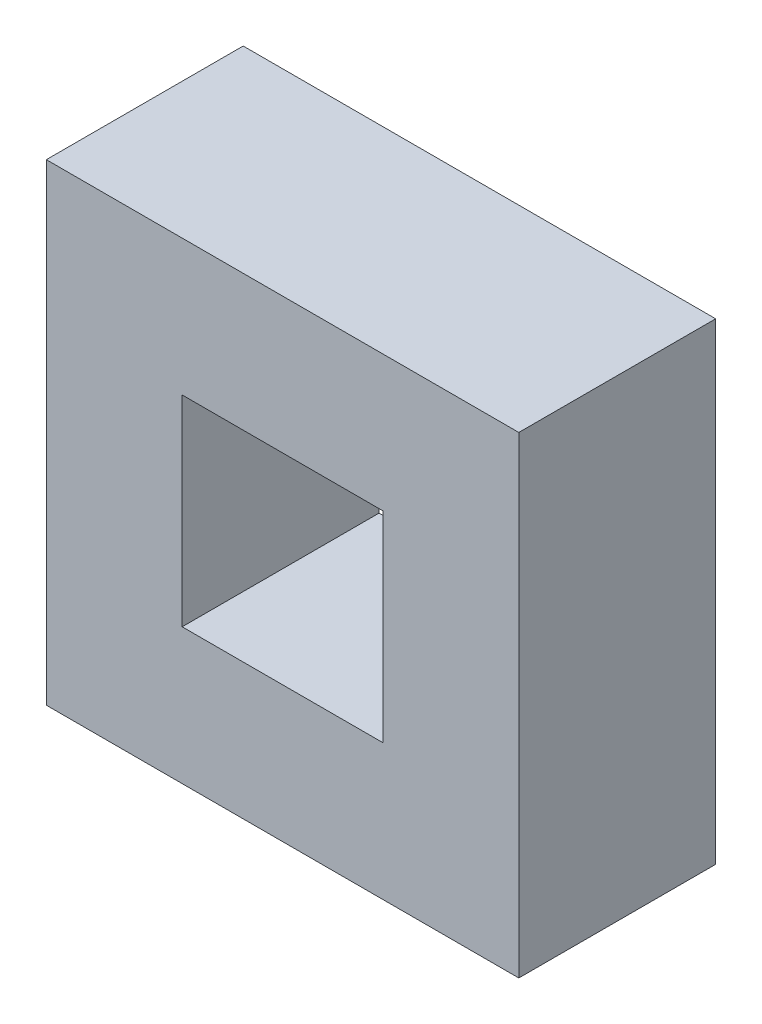
ISO-10303-21;
HEADER;
FILE_DESCRIPTION(('STEP AP214'),'2;1');
FILE_NAME('part.step','',(''),(''),'','','');
FILE_SCHEMA(('AUTOMOTIVE_DESIGN { 1 0 10303 214 1 1 1 1 }'));
ENDSEC;
DATA;
#1=APPLICATION_CONTEXT('core data for automotive mechanical design processes');
#2=APPLICATION_PROTOCOL_DEFINITION('international standard','automotive_design',2000,#1);
#3=PRODUCT_CONTEXT('',#1,'mechanical');
#4=PRODUCT('Part','Part','',(#3));
#5=PRODUCT_RELATED_PRODUCT_CATEGORY('part','',(#4));
#6=PRODUCT_DEFINITION_FORMATION('','',#4);
#7=PRODUCT_DEFINITION_CONTEXT('part definition',#1,'design');
#8=PRODUCT_DEFINITION('design','',#6,#7);
#9=PRODUCT_DEFINITION_SHAPE('','',#8);
#10=(LENGTH_UNIT() NAMED_UNIT(*) SI_UNIT(.MILLI.,.METRE.));
#11=(NAMED_UNIT(*) PLANE_ANGLE_UNIT() SI_UNIT($,.RADIAN.));
#12=(NAMED_UNIT(*) SI_UNIT($,.STERADIAN.) SOLID_ANGLE_UNIT());
#13=UNCERTAINTY_MEASURE_WITH_UNIT(LENGTH_MEASURE(1.E-05),#10,'distance_accuracy_value','');
#14=(GEOMETRIC_REPRESENTATION_CONTEXT(3) GLOBAL_UNCERTAINTY_ASSIGNED_CONTEXT((#13)) GLOBAL_UNIT_ASSIGNED_CONTEXT((#10,
#11,#12)) REPRESENTATION_CONTEXT('',''));
#15=CARTESIAN_POINT('',(0.,0.,0.));
#16=DIRECTION('',(0.,0.,1.));
#17=DIRECTION('',(1.,0.,0.));
#18=AXIS2_PLACEMENT_3D('',#15,#16,#17);
#19=CARTESIAN_POINT('',(0.,0.,50.));
#20=DIRECTION('',(0.,0.,1.));
#21=DIRECTION('',(1.,0.,0.));
#22=AXIS2_PLACEMENT_3D('',#19,#20,#21);
#23=PLANE('',#22);
#24=DIRECTION('',(0.,-1.,0.));
#25=VECTOR('',#24,1.);
#26=CARTESIAN_POINT('',(-60.,60.,50.));
#27=LINE('',#26,#25);
#28=CARTESIAN_POINT('',(-60.,60.,50.));
#29=VERTEX_POINT('',#28);
#30=CARTESIAN_POINT('',(-60.,-60.,50.));
#31=VERTEX_POINT('',#30);
#32=EDGE_CURVE('E133',#29,#31,#27,.T.);
#33=ORIENTED_EDGE('',*,*,#32,.T.);
#34=DIRECTION('',(1.,0.,0.));
#35=VECTOR('',#34,1.);
#36=CARTESIAN_POINT('',(-60.,-60.,50.));
#37=LINE('',#36,#35);
#38=CARTESIAN_POINT('',(60.,-60.,50.));
#39=VERTEX_POINT('',#38);
#40=EDGE_CURVE('E136',#31,#39,#37,.T.);
#41=ORIENTED_EDGE('',*,*,#40,.T.);
#42=DIRECTION('',(0.,1.,0.));
#43=VECTOR('',#42,1.);
#44=CARTESIAN_POINT('',(60.,60.,50.));
#45=LINE('',#44,#43);
#46=CARTESIAN_POINT('',(60.,60.,50.));
#47=VERTEX_POINT('',#46);
#48=EDGE_CURVE('E139',#39,#47,#45,.T.);
#49=ORIENTED_EDGE('',*,*,#48,.T.);
#50=DIRECTION('',(-1.,0.,0.));
#51=VECTOR('',#50,1.);
#52=CARTESIAN_POINT('',(-60.,60.,50.));
#53=LINE('',#52,#51);
#54=EDGE_CURVE('E141',#47,#29,#53,.T.);
#55=ORIENTED_EDGE('',*,*,#54,.T.);
#56=EDGE_LOOP('',(#33,#41,#49,#55));
#57=FACE_BOUND('',#56,.T.);
#58=DIRECTION('',(1.,0.,0.));
#59=VECTOR('',#58,1.);
#60=CARTESIAN_POINT('',(-25.5,-25.5,50.));
#61=LINE('',#60,#59);
#62=CARTESIAN_POINT('',(-25.5,-25.5,50.));
#63=VERTEX_POINT('',#62);
#64=CARTESIAN_POINT('',(25.5,-25.5,50.));
#65=VERTEX_POINT('',#64);
#66=EDGE_CURVE('E105',#63,#65,#61,.T.);
#67=ORIENTED_EDGE('',*,*,#66,.F.);
#68=DIRECTION('',(0.,-1.,0.));
#69=VECTOR('',#68,1.);
#70=CARTESIAN_POINT('',(-25.5,25.5,50.));
#71=LINE('',#70,#69);
#72=CARTESIAN_POINT('',(-25.5,25.5,50.));
#73=VERTEX_POINT('',#72);
#74=EDGE_CURVE('E97',#73,#63,#71,.T.);
#75=ORIENTED_EDGE('',*,*,#74,.F.);
#76=DIRECTION('',(-1.,0.,0.));
#77=VECTOR('',#76,1.);
#78=CARTESIAN_POINT('',(-25.5,25.5,50.));
#79=LINE('',#78,#77);
#80=CARTESIAN_POINT('',(25.5,25.5,50.));
#81=VERTEX_POINT('',#80);
#82=EDGE_CURVE('E119',#81,#73,#79,.T.);
#83=ORIENTED_EDGE('',*,*,#82,.F.);
#84=DIRECTION('',(0.,1.,0.));
#85=VECTOR('',#84,1.);
#86=CARTESIAN_POINT('',(25.5,25.5,50.));
#87=LINE('',#86,#85);
#88=EDGE_CURVE('E117',#65,#81,#87,.T.);
#89=ORIENTED_EDGE('',*,*,#88,.F.);
#90=EDGE_LOOP('',(#67,#75,#83,#89));
#91=FACE_BOUND('',#90,.T.);
#92=ADVANCED_FACE('F32',(#57,#91),#23,.T.);
#93=CARTESIAN_POINT('',(0.,0.,0.));
#94=DIRECTION('',(0.,0.,1.));
#95=DIRECTION('',(1.,0.,0.));
#96=AXIS2_PLACEMENT_3D('',#93,#94,#95);
#97=PLANE('',#96);
#98=DIRECTION('',(0.,-1.,0.));
#99=VECTOR('',#98,1.);
#100=CARTESIAN_POINT('',(-60.,60.,0.));
#101=LINE('',#100,#99);
#102=CARTESIAN_POINT('',(-60.,60.,0.));
#103=VERTEX_POINT('',#102);
#104=CARTESIAN_POINT('',(-60.,-60.,0.));
#105=VERTEX_POINT('',#104);
#106=EDGE_CURVE('E113',#103,#105,#101,.T.);
#107=ORIENTED_EDGE('',*,*,#106,.F.);
#108=DIRECTION('',(-1.,0.,0.));
#109=VECTOR('',#108,1.);
#110=CARTESIAN_POINT('',(-60.,60.,0.));
#111=LINE('',#110,#109);
#112=CARTESIAN_POINT('',(60.,60.,0.));
#113=VERTEX_POINT('',#112);
#114=EDGE_CURVE('E137',#113,#103,#111,.T.);
#115=ORIENTED_EDGE('',*,*,#114,.F.);
#116=DIRECTION('',(0.,1.,0.));
#117=VECTOR('',#116,1.);
#118=CARTESIAN_POINT('',(60.,60.,0.));
#119=LINE('',#118,#117);
#120=CARTESIAN_POINT('',(60.,-60.,0.));
#121=VERTEX_POINT('',#120);
#122=EDGE_CURVE('E148',#121,#113,#119,.T.);
#123=ORIENTED_EDGE('',*,*,#122,.F.);
#124=DIRECTION('',(1.,0.,0.));
#125=VECTOR('',#124,1.);
#126=CARTESIAN_POINT('',(-60.,-60.,0.));
#127=LINE('',#126,#125);
#128=EDGE_CURVE('E146',#105,#121,#127,.T.);
#129=ORIENTED_EDGE('',*,*,#128,.F.);
#130=EDGE_LOOP('',(#107,#115,#123,#129));
#131=FACE_BOUND('',#130,.T.);
#132=DIRECTION('',(0.,-1.,0.));
#133=VECTOR('',#132,1.);
#134=CARTESIAN_POINT('',(-25.5,25.5,0.));
#135=LINE('',#134,#133);
#136=CARTESIAN_POINT('',(-25.5,25.5,0.));
#137=VERTEX_POINT('',#136);
#138=CARTESIAN_POINT('',(-25.5,-25.5,0.));
#139=VERTEX_POINT('',#138);
#140=EDGE_CURVE('E55',#137,#139,#135,.T.);
#141=ORIENTED_EDGE('',*,*,#140,.T.);
#142=DIRECTION('',(1.,0.,0.));
#143=VECTOR('',#142,1.);
#144=CARTESIAN_POINT('',(-25.5,-25.5,0.));
#145=LINE('',#144,#143);
#146=CARTESIAN_POINT('',(25.5,-25.5,0.));
#147=VERTEX_POINT('',#146);
#148=EDGE_CURVE('E112',#139,#147,#145,.T.);
#149=ORIENTED_EDGE('',*,*,#148,.T.);
#150=DIRECTION('',(0.,1.,0.));
#151=VECTOR('',#150,1.);
#152=CARTESIAN_POINT('',(25.5,25.5,0.));
#153=LINE('',#152,#151);
#154=CARTESIAN_POINT('',(25.5,25.5,0.));
#155=VERTEX_POINT('',#154);
#156=EDGE_CURVE('E125',#147,#155,#153,.T.);
#157=ORIENTED_EDGE('',*,*,#156,.T.);
#158=DIRECTION('',(-1.,0.,0.));
#159=VECTOR('',#158,1.);
#160=CARTESIAN_POINT('',(-25.5,25.5,0.));
#161=LINE('',#160,#159);
#162=EDGE_CURVE('E106',#155,#137,#161,.T.);
#163=ORIENTED_EDGE('',*,*,#162,.T.);
#164=EDGE_LOOP('',(#141,#149,#157,#163));
#165=FACE_BOUND('',#164,.T.);
#166=ADVANCED_FACE('F166',(#131,#165),#97,.F.);
#167=CARTESIAN_POINT('',(-60.,60.,50.));
#168=DIRECTION('',(1.,0.,0.));
#169=DIRECTION('',(0.,1.,0.));
#170=AXIS2_PLACEMENT_3D('',#167,#168,#169);
#171=PLANE('',#170);
#172=ORIENTED_EDGE('',*,*,#106,.T.);
#173=DIRECTION('',(0.,0.,-1.));
#174=VECTOR('',#173,1.);
#175=CARTESIAN_POINT('',(-60.,-60.,50.));
#176=LINE('',#175,#174);
#177=EDGE_CURVE('E11',#31,#105,#176,.T.);
#178=ORIENTED_EDGE('',*,*,#177,.F.);
#179=ORIENTED_EDGE('',*,*,#32,.F.);
#180=DIRECTION('',(0.,0.,-1.));
#181=VECTOR('',#180,1.);
#182=CARTESIAN_POINT('',(-60.,60.,50.));
#183=LINE('',#182,#181);
#184=EDGE_CURVE('E143',#29,#103,#183,.T.);
#185=ORIENTED_EDGE('',*,*,#184,.T.);
#186=EDGE_LOOP('',(#172,#178,#179,#185));
#187=FACE_BOUND('',#186,.T.);
#188=ADVANCED_FACE('F34',(#187),#171,.F.);
#189=CARTESIAN_POINT('',(-60.,-60.,50.));
#190=DIRECTION('',(0.,1.,0.));
#191=DIRECTION('',(0.,0.,1.));
#192=AXIS2_PLACEMENT_3D('',#189,#190,#191);
#193=PLANE('',#192);
#194=ORIENTED_EDGE('',*,*,#128,.T.);
#195=DIRECTION('',(0.,0.,-1.));
#196=VECTOR('',#195,1.);
#197=CARTESIAN_POINT('',(60.,-60.,50.));
#198=LINE('',#197,#196);
#199=EDGE_CURVE('E40',#39,#121,#198,.T.);
#200=ORIENTED_EDGE('',*,*,#199,.F.);
#201=ORIENTED_EDGE('',*,*,#40,.F.);
#202=ORIENTED_EDGE('',*,*,#177,.T.);
#203=EDGE_LOOP('',(#194,#200,#201,#202));
#204=FACE_BOUND('',#203,.T.);
#205=ADVANCED_FACE('F176',(#204),#193,.F.);
#206=CARTESIAN_POINT('',(60.,60.,50.));
#207=DIRECTION('',(-1.,0.,0.));
#208=DIRECTION('',(0.,-1.,0.));
#209=AXIS2_PLACEMENT_3D('',#206,#207,#208);
#210=PLANE('',#209);
#211=ORIENTED_EDGE('',*,*,#122,.T.);
#212=DIRECTION('',(0.,0.,-1.));
#213=VECTOR('',#212,1.);
#214=CARTESIAN_POINT('',(60.,60.,50.));
#215=LINE('',#214,#213);
#216=EDGE_CURVE('E153',#47,#113,#215,.T.);
#217=ORIENTED_EDGE('',*,*,#216,.F.);
#218=ORIENTED_EDGE('',*,*,#48,.F.);
#219=ORIENTED_EDGE('',*,*,#199,.T.);
#220=EDGE_LOOP('',(#211,#217,#218,#219));
#221=FACE_BOUND('',#220,.T.);
#222=ADVANCED_FACE('F160',(#221),#210,.F.);
#223=CARTESIAN_POINT('',(-60.,60.,50.));
#224=DIRECTION('',(0.,-1.,0.));
#225=DIRECTION('',(0.,0.,-1.));
#226=AXIS2_PLACEMENT_3D('',#223,#224,#225);
#227=PLANE('',#226);
#228=ORIENTED_EDGE('',*,*,#114,.T.);
#229=ORIENTED_EDGE('',*,*,#184,.F.);
#230=ORIENTED_EDGE('',*,*,#54,.F.);
#231=ORIENTED_EDGE('',*,*,#216,.T.);
#232=EDGE_LOOP('',(#228,#229,#230,#231));
#233=FACE_BOUND('',#232,.T.);
#234=ADVANCED_FACE('F170',(#233),#227,.F.);
#235=CARTESIAN_POINT('',(-25.5,25.5,50.));
#236=DIRECTION('',(1.,0.,0.));
#237=DIRECTION('',(0.,1.,0.));
#238=AXIS2_PLACEMENT_3D('',#235,#236,#237);
#239=PLANE('',#238);
#240=ORIENTED_EDGE('',*,*,#140,.F.);
#241=DIRECTION('',(0.,0.,-1.));
#242=VECTOR('',#241,1.);
#243=CARTESIAN_POINT('',(-25.5,25.5,50.));
#244=LINE('',#243,#242);
#245=EDGE_CURVE('E101',#73,#137,#244,.T.);
#246=ORIENTED_EDGE('',*,*,#245,.F.);
#247=ORIENTED_EDGE('',*,*,#74,.T.);
#248=DIRECTION('',(0.,0.,-1.));
#249=VECTOR('',#248,1.);
#250=CARTESIAN_POINT('',(-25.5,-25.5,50.));
#251=LINE('',#250,#249);
#252=EDGE_CURVE('E100',#63,#139,#251,.T.);
#253=ORIENTED_EDGE('',*,*,#252,.T.);
#254=EDGE_LOOP('',(#240,#246,#247,#253));
#255=FACE_BOUND('',#254,.T.);
#256=ADVANCED_FACE('F99',(#255),#239,.T.);
#257=CARTESIAN_POINT('',(-25.5,-25.5,50.));
#258=DIRECTION('',(0.,1.,0.));
#259=DIRECTION('',(0.,0.,1.));
#260=AXIS2_PLACEMENT_3D('',#257,#258,#259);
#261=PLANE('',#260);
#262=ORIENTED_EDGE('',*,*,#148,.F.);
#263=ORIENTED_EDGE('',*,*,#252,.F.);
#264=ORIENTED_EDGE('',*,*,#66,.T.);
#265=DIRECTION('',(0.,0.,-1.));
#266=VECTOR('',#265,1.);
#267=CARTESIAN_POINT('',(25.5,-25.5,50.));
#268=LINE('',#267,#266);
#269=EDGE_CURVE('E114',#65,#147,#268,.T.);
#270=ORIENTED_EDGE('',*,*,#269,.T.);
#271=EDGE_LOOP('',(#262,#263,#264,#270));
#272=FACE_BOUND('',#271,.T.);
#273=ADVANCED_FACE('F109',(#272),#261,.T.);
#274=CARTESIAN_POINT('',(25.5,25.5,50.));
#275=DIRECTION('',(-1.,0.,0.));
#276=DIRECTION('',(0.,-1.,0.));
#277=AXIS2_PLACEMENT_3D('',#274,#275,#276);
#278=PLANE('',#277);
#279=ORIENTED_EDGE('',*,*,#156,.F.);
#280=ORIENTED_EDGE('',*,*,#269,.F.);
#281=ORIENTED_EDGE('',*,*,#88,.T.);
#282=DIRECTION('',(0.,0.,-1.));
#283=VECTOR('',#282,1.);
#284=CARTESIAN_POINT('',(25.5,25.5,50.));
#285=LINE('',#284,#283);
#286=EDGE_CURVE('E47',#81,#155,#285,.T.);
#287=ORIENTED_EDGE('',*,*,#286,.T.);
#288=EDGE_LOOP('',(#279,#280,#281,#287));
#289=FACE_BOUND('',#288,.T.);
#290=ADVANCED_FACE('F199',(#289),#278,.T.);
#291=CARTESIAN_POINT('',(-25.5,25.5,50.));
#292=DIRECTION('',(0.,-1.,0.));
#293=DIRECTION('',(0.,0.,-1.));
#294=AXIS2_PLACEMENT_3D('',#291,#292,#293);
#295=PLANE('',#294);
#296=ORIENTED_EDGE('',*,*,#162,.F.);
#297=ORIENTED_EDGE('',*,*,#286,.F.);
#298=ORIENTED_EDGE('',*,*,#82,.T.);
#299=ORIENTED_EDGE('',*,*,#245,.T.);
#300=EDGE_LOOP('',(#296,#297,#298,#299));
#301=FACE_BOUND('',#300,.T.);
#302=ADVANCED_FACE('F203',(#301),#295,.T.);
#303=CLOSED_SHELL('',(#92,#166,#188,#205,#222,#234,#256,#273,#290,#302));
#304=MANIFOLD_SOLID_BREP('B2',#303);
#305=ADVANCED_BREP_SHAPE_REPRESENTATION('',(#18,#304),#14);
#306=SHAPE_DEFINITION_REPRESENTATION(#9,#305);
ENDSEC;
END-ISO-10303-21;
